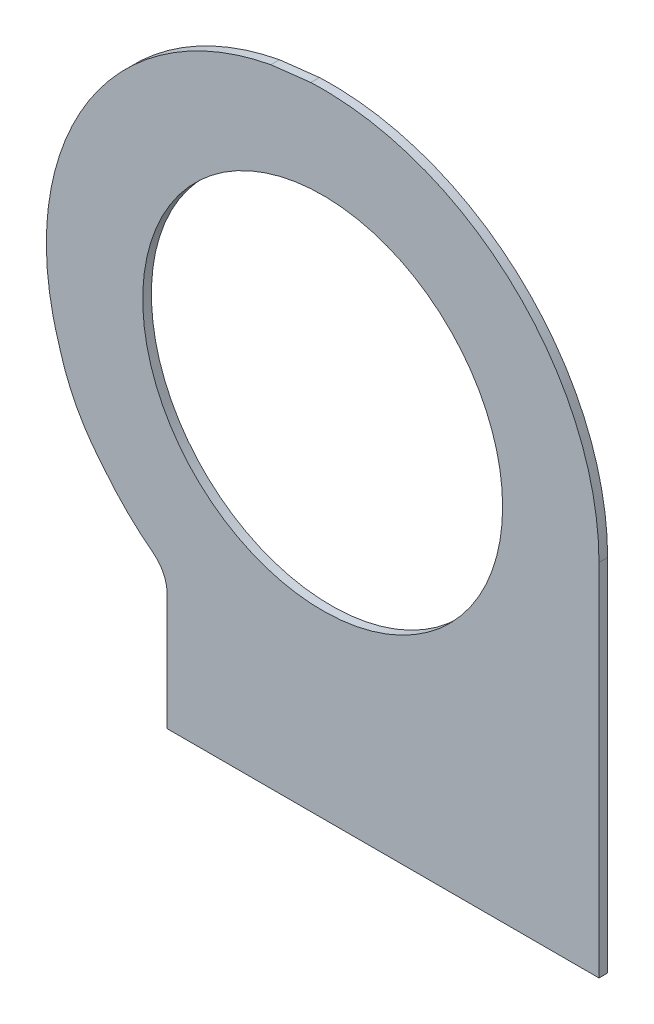
ISO-10303-21;
HEADER;
FILE_DESCRIPTION(('STEP AP214'),'2;1');
FILE_NAME('part.step','',(''),(''),'','','');
FILE_SCHEMA(('AUTOMOTIVE_DESIGN { 1 0 10303 214 1 1 1 1 }'));
ENDSEC;
DATA;
#1=APPLICATION_CONTEXT('core data for automotive mechanical design processes');
#2=APPLICATION_PROTOCOL_DEFINITION('international standard','automotive_design',2000,#1);
#3=PRODUCT_CONTEXT('',#1,'mechanical');
#4=PRODUCT('Part','Part','',(#3));
#5=PRODUCT_RELATED_PRODUCT_CATEGORY('part','',(#4));
#6=PRODUCT_DEFINITION_FORMATION('','',#4);
#7=PRODUCT_DEFINITION_CONTEXT('part definition',#1,'design');
#8=PRODUCT_DEFINITION('design','',#6,#7);
#9=PRODUCT_DEFINITION_SHAPE('','',#8);
#10=(LENGTH_UNIT() NAMED_UNIT(*) SI_UNIT(.MILLI.,.METRE.));
#11=(NAMED_UNIT(*) PLANE_ANGLE_UNIT() SI_UNIT($,.RADIAN.));
#12=(NAMED_UNIT(*) SI_UNIT($,.STERADIAN.) SOLID_ANGLE_UNIT());
#13=UNCERTAINTY_MEASURE_WITH_UNIT(LENGTH_MEASURE(1.E-05),#10,'distance_accuracy_value','');
#14=(GEOMETRIC_REPRESENTATION_CONTEXT(3) GLOBAL_UNCERTAINTY_ASSIGNED_CONTEXT((#13)) GLOBAL_UNIT_ASSIGNED_CONTEXT((#10,
#11,#12)) REPRESENTATION_CONTEXT('',''));
#15=CARTESIAN_POINT('',(0.,0.,0.));
#16=DIRECTION('',(0.,0.,1.));
#17=DIRECTION('',(1.,0.,0.));
#18=AXIS2_PLACEMENT_3D('',#15,#16,#17);
#19=CARTESIAN_POINT('',(31.9740334420294,0.,1.2));
#20=DIRECTION('',(1.,0.,0.));
#21=DIRECTION('',(0.,1.,0.));
#22=AXIS2_PLACEMENT_3D('',#19,#20,#21);
#23=PLANE('',#22);
#24=DIRECTION('',(0.,-1.,0.));
#25=VECTOR('',#24,1.);
#26=CARTESIAN_POINT('',(31.9740334420294,0.,0.));
#27=LINE('',#26,#25);
#28=CARTESIAN_POINT('',(31.9740334420294,40.9390333863678,0.));
#29=VERTEX_POINT('',#28);
#30=CARTESIAN_POINT('',(31.9740334420294,24.7109117874853,0.));
#31=VERTEX_POINT('',#30);
#32=EDGE_CURVE('E226',#29,#31,#27,.T.);
#33=ORIENTED_EDGE('',*,*,#32,.T.);
#34=DIRECTION('',(0.,0.,-1.));
#35=VECTOR('',#34,1.);
#36=CARTESIAN_POINT('',(31.9740334420294,24.7109117874853,1.2));
#37=LINE('',#36,#35);
#38=CARTESIAN_POINT('',(31.9740334420294,24.7109117874853,1.2));
#39=VERTEX_POINT('',#38);
#40=EDGE_CURVE('E11',#39,#31,#37,.T.);
#41=ORIENTED_EDGE('',*,*,#40,.F.);
#42=DIRECTION('',(0.,-1.,0.));
#43=VECTOR('',#42,1.);
#44=CARTESIAN_POINT('',(31.9740334420294,0.,1.2));
#45=LINE('',#44,#43);
#46=CARTESIAN_POINT('',(31.9740334420294,40.9390333863678,1.2));
#47=VERTEX_POINT('',#46);
#48=EDGE_CURVE('E251',#47,#39,#45,.T.);
#49=ORIENTED_EDGE('',*,*,#48,.F.);
#50=DIRECTION('',(0.,0.,-1.));
#51=VECTOR('',#50,1.);
#52=CARTESIAN_POINT('',(31.9740334420294,40.9390333863678,1.2));
#53=LINE('',#52,#51);
#54=EDGE_CURVE('E51',#47,#29,#53,.T.);
#55=ORIENTED_EDGE('',*,*,#54,.T.);
#56=EDGE_LOOP('',(#33,#41,#49,#55));
#57=FACE_BOUND('',#56,.T.);
#58=ADVANCED_FACE('F35',(#57),#23,.F.);
#59=CARTESIAN_POINT('',(0.,24.7109117874853,1.2));
#60=DIRECTION('',(0.,1.,0.));
#61=DIRECTION('',(0.,0.,1.));
#62=AXIS2_PLACEMENT_3D('',#59,#60,#61);
#63=PLANE('',#62);
#64=DIRECTION('',(1.,0.,0.));
#65=VECTOR('',#64,1.);
#66=CARTESIAN_POINT('',(0.,24.7109117874853,0.));
#67=LINE('',#66,#65);
#68=CARTESIAN_POINT('',(91.9739794722698,24.7109117874853,0.));
#69=VERTEX_POINT('',#68);
#70=EDGE_CURVE('E219',#31,#69,#67,.T.);
#71=ORIENTED_EDGE('',*,*,#70,.T.);
#72=DIRECTION('',(0.,0.,-1.));
#73=VECTOR('',#72,1.);
#74=CARTESIAN_POINT('',(91.9739794722698,24.7109117874853,1.2));
#75=LINE('',#74,#73);
#76=CARTESIAN_POINT('',(91.9739794722698,24.7109117874853,1.2));
#77=VERTEX_POINT('',#76);
#78=EDGE_CURVE('E43',#77,#69,#75,.T.);
#79=ORIENTED_EDGE('',*,*,#78,.F.);
#80=DIRECTION('',(1.,0.,0.));
#81=VECTOR('',#80,1.);
#82=CARTESIAN_POINT('',(0.,24.7109117874853,1.2));
#83=LINE('',#82,#81);
#84=EDGE_CURVE('E99',#39,#77,#83,.T.);
#85=ORIENTED_EDGE('',*,*,#84,.F.);
#86=ORIENTED_EDGE('',*,*,#40,.T.);
#87=EDGE_LOOP('',(#71,#79,#85,#86));
#88=FACE_BOUND('',#87,.T.);
#89=ADVANCED_FACE('F262',(#88),#63,.F.);
#90=CARTESIAN_POINT('',(91.9739641584129,-5.69980134191851E-05,1.2));
#91=DIRECTION('',(-0.999999999999808,6.19719003532377E-07,0.));
#92=DIRECTION('',(-6.19719003532377E-07,-0.999999999999808,0.));
#93=AXIS2_PLACEMENT_3D('',#90,#91,#92);
#94=PLANE('',#93);
#95=DIRECTION('',(6.19719003532377E-07,0.999999999999808,0.));
#96=VECTOR('',#95,1.);
#97=CARTESIAN_POINT('',(91.9739641584129,-5.69980134191851E-05,0.));
#98=LINE('',#97,#96);
#99=CARTESIAN_POINT('',(91.9740104582025,74.710883533232,0.));
#100=VERTEX_POINT('',#99);
#101=EDGE_CURVE('E213',#69,#100,#98,.T.);
#102=ORIENTED_EDGE('',*,*,#101,.T.);
#103=DIRECTION('',(0.,0.,-1.));
#104=VECTOR('',#103,1.);
#105=CARTESIAN_POINT('',(91.9740104582025,74.710883533232,1.2));
#106=LINE('',#105,#104);
#107=CARTESIAN_POINT('',(91.9740104582025,74.710883533232,1.2));
#108=VERTEX_POINT('',#107);
#109=EDGE_CURVE('E205',#108,#100,#106,.T.);
#110=ORIENTED_EDGE('',*,*,#109,.F.);
#111=DIRECTION('',(6.19719003532377E-07,0.999999999999808,0.));
#112=VECTOR('',#111,1.);
#113=CARTESIAN_POINT('',(91.9739641584129,-5.69980134191851E-05,1.2));
#114=LINE('',#113,#112);
#115=EDGE_CURVE('E214',#77,#108,#114,.T.);
#116=ORIENTED_EDGE('',*,*,#115,.F.);
#117=ORIENTED_EDGE('',*,*,#78,.T.);
#118=EDGE_LOOP('',(#102,#110,#116,#117));
#119=FACE_BOUND('',#118,.T.);
#120=ADVANCED_FACE('F211',(#119),#94,.F.);
#121=CARTESIAN_POINT('',(53.5853771690755,74.7109073233961,1.2));
#122=DIRECTION('',(0.,0.,1.));
#123=DIRECTION('',(-0.999999999999808,6.19718940753039E-07,0.));
#124=AXIS2_PLACEMENT_3D('',#121,#122,#123);
#125=ELLIPSE('',#124,38.3886332891338,37.7581857982453);
#126=DIRECTION('',(0.,0.,-1.));
#127=VECTOR('',#126,1.);
#128=SURFACE_OF_LINEAR_EXTRUSION('',#125,#127);
#129=CARTESIAN_POINT('',(53.5853771690755,74.7109073233961,0.));
#130=DIRECTION('',(0.,0.,1.));
#131=DIRECTION('',(-0.999999999999808,6.19718940753039E-07,0.));
#132=AXIS2_PLACEMENT_3D('',#129,#130,#131);
#133=ELLIPSE('',#132,38.3886332891338,37.7581857982453);
#134=CARTESIAN_POINT('',(51.9330546543836,112.43410131756,0.));
#135=VERTEX_POINT('',#134);
#136=EDGE_CURVE('E222',#100,#135,#133,.T.);
#137=ORIENTED_EDGE('',*,*,#136,.T.);
#138=DIRECTION('',(0.,0.,-1.));
#139=VECTOR('',#138,1.);
#140=CARTESIAN_POINT('',(51.9330546543836,112.43410131756,1.2));
#141=LINE('',#140,#139);
#142=CARTESIAN_POINT('',(51.9330546543836,112.43410131756,1.2));
#143=VERTEX_POINT('',#142);
#144=EDGE_CURVE('E199',#143,#135,#141,.T.);
#145=ORIENTED_EDGE('',*,*,#144,.F.);
#146=EDGE_CURVE('E272',#108,#143,#125,.T.);
#147=ORIENTED_EDGE('',*,*,#146,.F.);
#148=ORIENTED_EDGE('',*,*,#109,.T.);
#149=EDGE_LOOP('',(#137,#145,#147,#148));
#150=FACE_BOUND('',#149,.T.);
#151=ADVANCED_FACE('F274',(#150),#128,.F.);
#152=CARTESIAN_POINT('',(-12.0368868525199,105.108336558119,1.2));
#153=DIRECTION('',(-0.113775233302971,0.993506515472775,0.));
#154=DIRECTION('',(-0.993506515472775,-0.113775233302971,0.));
#155=AXIS2_PLACEMENT_3D('',#152,#153,#154);
#156=PLANE('',#155);
#157=DIRECTION('',(0.993506515472775,0.113775233302971,0.));
#158=VECTOR('',#157,1.);
#159=CARTESIAN_POINT('',(-12.0368868525199,105.108336558119,0.));
#160=LINE('',#159,#158);
#161=CARTESIAN_POINT('',(46.3819815021323,111.798398749793,0.));
#162=VERTEX_POINT('',#161);
#163=EDGE_CURVE('E224',#162,#135,#160,.T.);
#164=ORIENTED_EDGE('',*,*,#163,.F.);
#165=DIRECTION('',(0.,0.,-1.));
#166=VECTOR('',#165,1.);
#167=CARTESIAN_POINT('',(46.3819815021323,111.798398749793,1.2));
#168=LINE('',#167,#166);
#169=CARTESIAN_POINT('',(46.3819815021323,111.798398749793,1.2));
#170=VERTEX_POINT('',#169);
#171=EDGE_CURVE('E197',#170,#162,#168,.T.);
#172=ORIENTED_EDGE('',*,*,#171,.F.);
#173=DIRECTION('',(0.993506515472775,0.113775233302971,0.));
#174=VECTOR('',#173,1.);
#175=CARTESIAN_POINT('',(-12.0368868525199,105.108336558119,1.2));
#176=LINE('',#175,#174);
#177=EDGE_CURVE('E183',#170,#143,#176,.T.);
#178=ORIENTED_EDGE('',*,*,#177,.T.);
#179=ORIENTED_EDGE('',*,*,#144,.T.);
#180=EDGE_LOOP('',(#164,#172,#178,#179));
#181=FACE_BOUND('',#180,.T.);
#182=ADVANCED_FACE('F177',(#181),#156,.T.);
#183=CARTESIAN_POINT('',(53.5854001528953,74.7109117874853,1.2));
#184=DIRECTION('',(0.,0.,1.));
#185=DIRECTION('',(-1.,0.,0.));
#186=AXIS2_PLACEMENT_3D('',#183,#184,#185);
#187=ELLIPSE('',#186,38.3886332891341,37.7581857982453);
#188=DIRECTION('',(0.,0.,-1.));
#189=VECTOR('',#188,1.);
#190=SURFACE_OF_LINEAR_EXTRUSION('',#187,#189);
#191=CARTESIAN_POINT('',(53.5854001528953,74.7109117874853,0.));
#192=DIRECTION('',(0.,0.,1.));
#193=DIRECTION('',(-1.,0.,0.));
#194=AXIS2_PLACEMENT_3D('',#191,#192,#193);
#195=ELLIPSE('',#194,38.3886332891341,37.7581857982453);
#196=CARTESIAN_POINT('',(16.9776743586811,63.343823340066,0.));
#197=VERTEX_POINT('',#196);
#198=EDGE_CURVE('E195',#162,#197,#195,.T.);
#199=ORIENTED_EDGE('',*,*,#198,.T.);
#200=DIRECTION('',(0.,0.,-1.));
#201=VECTOR('',#200,1.);
#202=CARTESIAN_POINT('',(16.9776743586811,63.343823340066,1.2));
#203=LINE('',#202,#201);
#204=CARTESIAN_POINT('',(16.9776743586811,63.343823340066,1.2));
#205=VERTEX_POINT('',#204);
#206=EDGE_CURVE('E188',#205,#197,#203,.T.);
#207=ORIENTED_EDGE('',*,*,#206,.F.);
#208=EDGE_CURVE('E180',#170,#205,#187,.T.);
#209=ORIENTED_EDGE('',*,*,#208,.F.);
#210=ORIENTED_EDGE('',*,*,#171,.T.);
#211=EDGE_LOOP('',(#199,#207,#209,#210));
#212=FACE_BOUND('',#211,.T.);
#213=ADVANCED_FACE('F172',(#212),#190,.F.);
#214=CARTESIAN_POINT('',(12.2168909391347,61.8157718906139,1.2));
#215=DIRECTION('',(0.,0.,-1.));
#216=DIRECTION('',(-1.,0.,0.));
#217=AXIS2_PLACEMENT_3D('',#214,#215,#216);
#218=CYLINDRICAL_SURFACE('',#217,4.99999999999999);
#219=CARTESIAN_POINT('',(12.2168909391347,61.8157718906139,0.));
#220=DIRECTION('',(0.,0.,1.));
#221=DIRECTION('',(1.,0.,0.));
#222=AXIS2_PLACEMENT_3D('',#219,#220,#221);
#223=CIRCLE('',#222,4.99999999999999);
#224=CARTESIAN_POINT('',(17.09504392069,62.9128696476725,0.));
#225=VERTEX_POINT('',#224);
#226=EDGE_CURVE('E232',#225,#197,#223,.T.);
#227=ORIENTED_EDGE('',*,*,#226,.F.);
#228=DIRECTION('',(0.,0.,-1.));
#229=VECTOR('',#228,1.);
#230=CARTESIAN_POINT('',(17.09504392069,62.9128696476725,1.2));
#231=LINE('',#230,#229);
#232=CARTESIAN_POINT('',(17.09504392069,62.9128696476725,1.2));
#233=VERTEX_POINT('',#232);
#234=EDGE_CURVE('E190',#233,#225,#231,.T.);
#235=ORIENTED_EDGE('',*,*,#234,.F.);
#236=CARTESIAN_POINT('',(12.2168909391347,61.8157718906139,1.2));
#237=DIRECTION('',(0.,0.,1.));
#238=DIRECTION('',(1.,0.,0.));
#239=AXIS2_PLACEMENT_3D('',#236,#237,#238);
#240=CIRCLE('',#239,4.99999999999999);
#241=EDGE_CURVE('E148',#233,#205,#240,.T.);
#242=ORIENTED_EDGE('',*,*,#241,.T.);
#243=ORIENTED_EDGE('',*,*,#206,.T.);
#244=EDGE_LOOP('',(#227,#235,#242,#243));
#245=FACE_BOUND('',#244,.T.);
#246=ADVANCED_FACE('F168',(#245),#218,.F.);
#247=CARTESIAN_POINT('',(16.9776743586811,63.343823340066,1.2));
#248=CARTESIAN_POINT('',(18.6767228789648,56.9213642508689,1.2));
#249=CARTESIAN_POINT('',(22.955645601897,51.9499632907495,1.2));
#250=B_SPLINE_CURVE_WITH_KNOTS('',2,(#247,#248,#249),.UNSPECIFIED.,.F.,.F.,(3,3),(0.,1.),.UNSPECIFIED.);
#251=DIRECTION('',(0.,0.,-1.));
#252=VECTOR('',#251,1.);
#253=SURFACE_OF_LINEAR_EXTRUSION('',#250,#252);
#254=CARTESIAN_POINT('',(16.9776743586811,63.343823340066,0.));
#255=CARTESIAN_POINT('',(18.6767228789648,56.9213642508689,0.));
#256=CARTESIAN_POINT('',(22.955645601897,51.9499632907495,0.));
#257=B_SPLINE_CURVE_WITH_KNOTS('',2,(#254,#255,#256),.UNSPECIFIED.,.F.,.F.,(3,3),(0.,1.),.UNSPECIFIED.);
#258=CARTESIAN_POINT('',(22.6479922646822,52.3132828503175,0.));
#259=VERTEX_POINT('',#258);
#260=EDGE_CURVE('E234',#225,#259,#257,.T.);
#261=ORIENTED_EDGE('',*,*,#260,.T.);
#262=DIRECTION('',(0.,0.,-1.));
#263=VECTOR('',#262,1.);
#264=CARTESIAN_POINT('',(22.6479922646822,52.3132828503175,1.2));
#265=LINE('',#264,#263);
#266=CARTESIAN_POINT('',(22.6479922646822,52.3132828503175,1.2));
#267=VERTEX_POINT('',#266);
#268=EDGE_CURVE('E133',#267,#259,#265,.T.);
#269=ORIENTED_EDGE('',*,*,#268,.F.);
#270=EDGE_CURVE('E145',#233,#267,#250,.T.);
#271=ORIENTED_EDGE('',*,*,#270,.F.);
#272=ORIENTED_EDGE('',*,*,#234,.T.);
#273=EDGE_LOOP('',(#261,#269,#271,#272));
#274=FACE_BOUND('',#273,.T.);
#275=ADVANCED_FACE('F165',(#274),#253,.F.);
#276=CARTESIAN_POINT('',(18.990400874808,48.9041736961955,1.2));
#277=DIRECTION('',(0.,0.,-1.));
#278=DIRECTION('',(-1.,0.,0.));
#279=AXIS2_PLACEMENT_3D('',#276,#277,#278);
#280=CYLINDRICAL_SURFACE('',#279,5.);
#281=CARTESIAN_POINT('',(18.990400874808,48.9041736961955,0.));
#282=DIRECTION('',(0.,0.,1.));
#283=DIRECTION('',(1.,0.,0.));
#284=AXIS2_PLACEMENT_3D('',#281,#282,#283);
#285=CIRCLE('',#284,5.);
#286=CARTESIAN_POINT('',(22.955645601897,51.9499632907495,0.));
#287=VERTEX_POINT('',#286);
#288=EDGE_CURVE('E130',#287,#259,#285,.T.);
#289=ORIENTED_EDGE('',*,*,#288,.F.);
#290=DIRECTION('',(0.,0.,-1.));
#291=VECTOR('',#290,1.);
#292=CARTESIAN_POINT('',(22.955645601897,51.9499632907495,1.2));
#293=LINE('',#292,#291);
#294=CARTESIAN_POINT('',(22.955645601897,51.9499632907495,1.2));
#295=VERTEX_POINT('',#294);
#296=EDGE_CURVE('E124',#295,#287,#293,.T.);
#297=ORIENTED_EDGE('',*,*,#296,.F.);
#298=CARTESIAN_POINT('',(18.990400874808,48.9041736961955,1.2));
#299=DIRECTION('',(0.,0.,1.));
#300=DIRECTION('',(1.,0.,0.));
#301=AXIS2_PLACEMENT_3D('',#298,#299,#300);
#302=CIRCLE('',#301,5.);
#303=EDGE_CURVE('E128',#295,#267,#302,.T.);
#304=ORIENTED_EDGE('',*,*,#303,.T.);
#305=ORIENTED_EDGE('',*,*,#268,.T.);
#306=EDGE_LOOP('',(#289,#297,#304,#305));
#307=FACE_BOUND('',#306,.T.);
#308=ADVANCED_FACE('F126',(#307),#280,.F.);
#309=CARTESIAN_POINT('',(53.5854001528953,74.7109117874853,1.2));
#310=DIRECTION('',(0.,0.,1.));
#311=DIRECTION('',(-1.,0.,0.));
#312=AXIS2_PLACEMENT_3D('',#309,#310,#311);
#313=ELLIPSE('',#312,38.3886332891341,37.7581857982453);
#314=DIRECTION('',(0.,0.,-1.));
#315=VECTOR('',#314,1.);
#316=SURFACE_OF_LINEAR_EXTRUSION('',#313,#315);
#317=CARTESIAN_POINT('',(53.5854001528953,74.7109117874853,0.));
#318=DIRECTION('',(0.,0.,1.));
#319=DIRECTION('',(-1.,0.,0.));
#320=AXIS2_PLACEMENT_3D('',#317,#318,#319);
#321=ELLIPSE('',#320,38.3886332891341,37.7581857982453);
#322=CARTESIAN_POINT('',(30.0126125516286,44.90980623239,0.));
#323=VERTEX_POINT('',#322);
#324=EDGE_CURVE('E243',#287,#323,#321,.T.);
#325=ORIENTED_EDGE('',*,*,#324,.T.);
#326=DIRECTION('',(0.,0.,-1.));
#327=VECTOR('',#326,1.);
#328=CARTESIAN_POINT('',(30.0126125516286,44.90980623239,1.2));
#329=LINE('',#328,#327);
#330=CARTESIAN_POINT('',(30.0126125516286,44.90980623239,1.2));
#331=VERTEX_POINT('',#330);
#332=EDGE_CURVE('E87',#331,#323,#329,.T.);
#333=ORIENTED_EDGE('',*,*,#332,.F.);
#334=EDGE_CURVE('E135',#295,#331,#313,.T.);
#335=ORIENTED_EDGE('',*,*,#334,.F.);
#336=ORIENTED_EDGE('',*,*,#296,.T.);
#337=EDGE_LOOP('',(#325,#333,#335,#336));
#338=FACE_BOUND('',#337,.T.);
#339=ADVANCED_FACE('F136',(#338),#316,.F.);
#340=CARTESIAN_POINT('',(26.9740334420294,40.9390333863678,1.2));
#341=DIRECTION('',(0.,0.,-1.));
#342=DIRECTION('',(-1.,0.,0.));
#343=AXIS2_PLACEMENT_3D('',#340,#341,#342);
#344=CYLINDRICAL_SURFACE('',#343,5.);
#345=CARTESIAN_POINT('',(26.9740334420294,40.9390333863678,0.));
#346=DIRECTION('',(0.,0.,1.));
#347=DIRECTION('',(1.,0.,0.));
#348=AXIS2_PLACEMENT_3D('',#345,#346,#347);
#349=CIRCLE('',#348,5.);
#350=EDGE_CURVE('E245',#29,#323,#349,.T.);
#351=ORIENTED_EDGE('',*,*,#350,.F.);
#352=ORIENTED_EDGE('',*,*,#54,.F.);
#353=CARTESIAN_POINT('',(26.9740334420294,40.9390333863678,1.2));
#354=DIRECTION('',(0.,0.,1.));
#355=DIRECTION('',(1.,0.,0.));
#356=AXIS2_PLACEMENT_3D('',#353,#354,#355);
#357=CIRCLE('',#356,5.);
#358=EDGE_CURVE('E139',#47,#331,#357,.T.);
#359=ORIENTED_EDGE('',*,*,#358,.T.);
#360=ORIENTED_EDGE('',*,*,#332,.T.);
#361=EDGE_LOOP('',(#351,#352,#359,#360));
#362=FACE_BOUND('',#361,.T.);
#363=ADVANCED_FACE('F161',(#362),#344,.F.);
#364=CARTESIAN_POINT('',(53.5854001528953,74.7109117874853,1.2));
#365=DIRECTION('',(0.,0.,-1.));
#366=DIRECTION('',(-1.,0.,0.));
#367=AXIS2_PLACEMENT_3D('',#364,#365,#366);
#368=CYLINDRICAL_SURFACE('',#367,25.);
#369=CARTESIAN_POINT('',(53.5854001528953,74.7109117874853,1.2));
#370=DIRECTION('',(0.,0.,1.));
#371=DIRECTION('',(1.,0.,0.));
#372=AXIS2_PLACEMENT_3D('',#369,#370,#371);
#373=CIRCLE('',#372,25.);
#374=CARTESIAN_POINT('',(78.5854001528952,74.7109117874853,1.2));
#375=VERTEX_POINT('',#374);
#376=EDGE_CURVE('E253',#375,#375,#373,.T.);
#377=ORIENTED_EDGE('',*,*,#376,.T.);
#378=EDGE_LOOP('',(#377));
#379=FACE_BOUND('',#378,.T.);
#380=CARTESIAN_POINT('',(53.5854001528953,74.7109117874853,0.));
#381=DIRECTION('',(0.,0.,1.));
#382=DIRECTION('',(1.,0.,0.));
#383=AXIS2_PLACEMENT_3D('',#380,#381,#382);
#384=CIRCLE('',#383,25.);
#385=CARTESIAN_POINT('',(78.5854001528952,74.7109117874853,0.));
#386=VERTEX_POINT('',#385);
#387=EDGE_CURVE('E248',#386,#386,#384,.T.);
#388=ORIENTED_EDGE('',*,*,#387,.F.);
#389=EDGE_LOOP('',(#388));
#390=FACE_BOUND('',#389,.T.);
#391=ADVANCED_FACE('F256',(#379,#390),#368,.F.);
#392=CARTESIAN_POINT('',(0.,0.,1.2));
#393=DIRECTION('',(0.,0.,1.));
#394=DIRECTION('',(1.,0.,0.));
#395=AXIS2_PLACEMENT_3D('',#392,#393,#394);
#396=PLANE('',#395);
#397=ORIENTED_EDGE('',*,*,#48,.T.);
#398=ORIENTED_EDGE('',*,*,#84,.T.);
#399=ORIENTED_EDGE('',*,*,#115,.T.);
#400=ORIENTED_EDGE('',*,*,#146,.T.);
#401=ORIENTED_EDGE('',*,*,#177,.F.);
#402=ORIENTED_EDGE('',*,*,#208,.T.);
#403=ORIENTED_EDGE('',*,*,#241,.F.);
#404=ORIENTED_EDGE('',*,*,#270,.T.);
#405=ORIENTED_EDGE('',*,*,#303,.F.);
#406=ORIENTED_EDGE('',*,*,#334,.T.);
#407=ORIENTED_EDGE('',*,*,#358,.F.);
#408=EDGE_LOOP('',(#397,#398,#399,#400,#401,#402,#403,#404,#405,#406,#407));
#409=FACE_BOUND('',#408,.T.);
#410=ORIENTED_EDGE('',*,*,#376,.F.);
#411=EDGE_LOOP('',(#410));
#412=FACE_BOUND('',#411,.T.);
#413=ADVANCED_FACE('F141',(#409,#412),#396,.T.);
#414=CARTESIAN_POINT('',(0.,0.,0.));
#415=DIRECTION('',(0.,0.,1.));
#416=DIRECTION('',(1.,0.,0.));
#417=AXIS2_PLACEMENT_3D('',#414,#415,#416);
#418=PLANE('',#417);
#419=ORIENTED_EDGE('',*,*,#32,.F.);
#420=ORIENTED_EDGE('',*,*,#350,.T.);
#421=ORIENTED_EDGE('',*,*,#324,.F.);
#422=ORIENTED_EDGE('',*,*,#288,.T.);
#423=ORIENTED_EDGE('',*,*,#260,.F.);
#424=ORIENTED_EDGE('',*,*,#226,.T.);
#425=ORIENTED_EDGE('',*,*,#198,.F.);
#426=ORIENTED_EDGE('',*,*,#163,.T.);
#427=ORIENTED_EDGE('',*,*,#136,.F.);
#428=ORIENTED_EDGE('',*,*,#101,.F.);
#429=ORIENTED_EDGE('',*,*,#70,.F.);
#430=EDGE_LOOP('',(#419,#420,#421,#422,#423,#424,#425,#426,#427,#428,#429));
#431=FACE_BOUND('',#430,.T.);
#432=ORIENTED_EDGE('',*,*,#387,.T.);
#433=EDGE_LOOP('',(#432));
#434=FACE_BOUND('',#433,.T.);
#435=ADVANCED_FACE('F217',(#431,#434),#418,.F.);
#436=CLOSED_SHELL('',(#58,#89,#120,#151,#182,#213,#246,#275,#308,#339,#363,#391,#413,#435));
#437=MANIFOLD_SOLID_BREP('B2',#436);
#438=ADVANCED_BREP_SHAPE_REPRESENTATION('',(#18,#437),#14);
#439=SHAPE_DEFINITION_REPRESENTATION(#9,#438);
ENDSEC;
END-ISO-10303-21;
